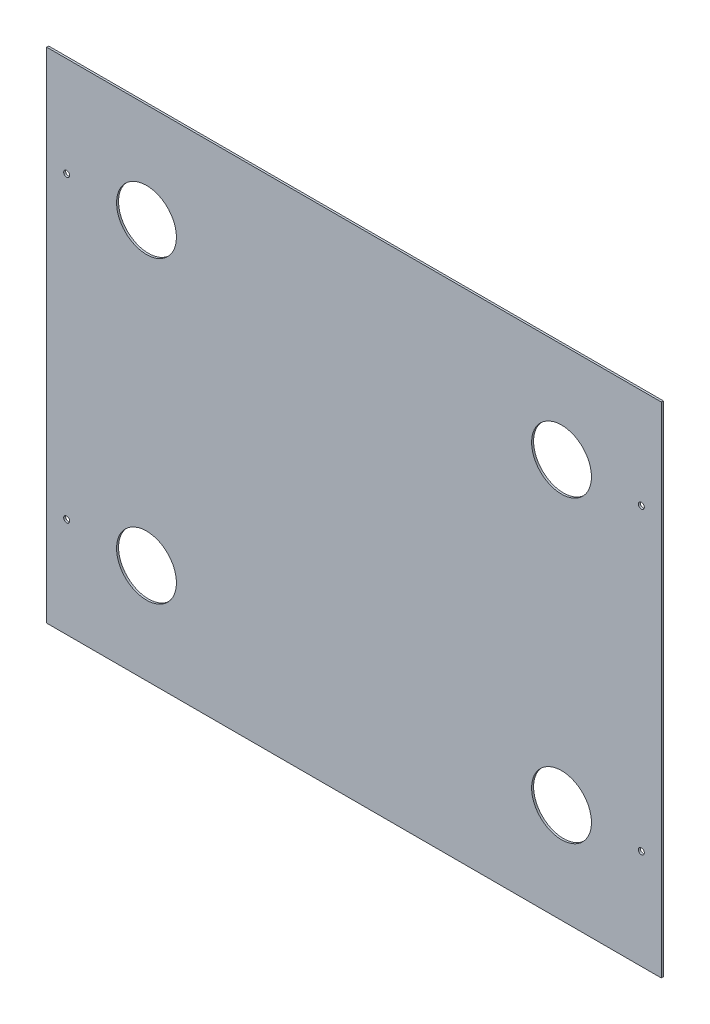
ISO-10303-21;
HEADER;
FILE_DESCRIPTION(('STEP AP214'),'2;1');
FILE_NAME('part.step','',(''),(''),'','','');
FILE_SCHEMA(('AUTOMOTIVE_DESIGN { 1 0 10303 214 1 1 1 1 }'));
ENDSEC;
DATA;
#1=APPLICATION_CONTEXT('core data for automotive mechanical design processes');
#2=APPLICATION_PROTOCOL_DEFINITION('international standard','automotive_design',2000,#1);
#3=PRODUCT_CONTEXT('',#1,'mechanical');
#4=PRODUCT('Part','Part','',(#3));
#5=PRODUCT_RELATED_PRODUCT_CATEGORY('part','',(#4));
#6=PRODUCT_DEFINITION_FORMATION('','',#4);
#7=PRODUCT_DEFINITION_CONTEXT('part definition',#1,'design');
#8=PRODUCT_DEFINITION('design','',#6,#7);
#9=PRODUCT_DEFINITION_SHAPE('','',#8);
#10=(LENGTH_UNIT() NAMED_UNIT(*) SI_UNIT(.MILLI.,.METRE.));
#11=(NAMED_UNIT(*) PLANE_ANGLE_UNIT() SI_UNIT($,.RADIAN.));
#12=(NAMED_UNIT(*) SI_UNIT($,.STERADIAN.) SOLID_ANGLE_UNIT());
#13=UNCERTAINTY_MEASURE_WITH_UNIT(LENGTH_MEASURE(1.E-05),#10,'distance_accuracy_value','');
#14=(GEOMETRIC_REPRESENTATION_CONTEXT(3) GLOBAL_UNCERTAINTY_ASSIGNED_CONTEXT((#13)) GLOBAL_UNIT_ASSIGNED_CONTEXT((#10,
#11,#12)) REPRESENTATION_CONTEXT('',''));
#15=CARTESIAN_POINT('',(0.,0.,0.));
#16=DIRECTION('',(0.,0.,1.));
#17=DIRECTION('',(1.,0.,0.));
#18=AXIS2_PLACEMENT_3D('',#15,#16,#17);
#19=CARTESIAN_POINT('',(0.,250.,1.));
#20=DIRECTION('',(1.,0.,0.));
#21=DIRECTION('',(0.,1.,0.));
#22=AXIS2_PLACEMENT_3D('',#19,#20,#21);
#23=PLANE('',#22);
#24=DIRECTION('',(0.,-1.,0.));
#25=VECTOR('',#24,1.);
#26=CARTESIAN_POINT('',(0.,250.,0.));
#27=LINE('',#26,#25);
#28=CARTESIAN_POINT('',(0.,250.,0.));
#29=VERTEX_POINT('',#28);
#30=CARTESIAN_POINT('',(0.,0.,0.));
#31=VERTEX_POINT('',#30);
#32=EDGE_CURVE('E95',#29,#31,#27,.T.);
#33=ORIENTED_EDGE('',*,*,#32,.T.);
#34=DIRECTION('',(0.,0.,-1.));
#35=VECTOR('',#34,1.);
#36=CARTESIAN_POINT('',(0.,0.,1.));
#37=LINE('',#36,#35);
#38=CARTESIAN_POINT('',(0.,0.,1.));
#39=VERTEX_POINT('',#38);
#40=EDGE_CURVE('E11',#39,#31,#37,.T.);
#41=ORIENTED_EDGE('',*,*,#40,.F.);
#42=DIRECTION('',(0.,-1.,0.));
#43=VECTOR('',#42,1.);
#44=CARTESIAN_POINT('',(0.,250.,1.));
#45=LINE('',#44,#43);
#46=CARTESIAN_POINT('',(0.,250.,1.));
#47=VERTEX_POINT('',#46);
#48=EDGE_CURVE('E83',#47,#39,#45,.T.);
#49=ORIENTED_EDGE('',*,*,#48,.F.);
#50=DIRECTION('',(0.,0.,-1.));
#51=VECTOR('',#50,1.);
#52=CARTESIAN_POINT('',(0.,250.,1.));
#53=LINE('',#52,#51);
#54=EDGE_CURVE('E91',#47,#29,#53,.T.);
#55=ORIENTED_EDGE('',*,*,#54,.T.);
#56=EDGE_LOOP('',(#33,#41,#49,#55));
#57=FACE_BOUND('',#56,.T.);
#58=ADVANCED_FACE('F32',(#57),#23,.F.);
#59=CARTESIAN_POINT('',(0.,0.,1.));
#60=DIRECTION('',(0.,1.,0.));
#61=DIRECTION('',(0.,0.,1.));
#62=AXIS2_PLACEMENT_3D('',#59,#60,#61);
#63=PLANE('',#62);
#64=DIRECTION('',(1.,0.,0.));
#65=VECTOR('',#64,1.);
#66=CARTESIAN_POINT('',(0.,0.,0.));
#67=LINE('',#66,#65);
#68=CARTESIAN_POINT('',(308.,0.,0.));
#69=VERTEX_POINT('',#68);
#70=EDGE_CURVE('E87',#31,#69,#67,.T.);
#71=ORIENTED_EDGE('',*,*,#70,.T.);
#72=DIRECTION('',(0.,0.,-1.));
#73=VECTOR('',#72,1.);
#74=CARTESIAN_POINT('',(308.,0.,1.));
#75=LINE('',#74,#73);
#76=CARTESIAN_POINT('',(308.,0.,1.));
#77=VERTEX_POINT('',#76);
#78=EDGE_CURVE('E40',#77,#69,#75,.T.);
#79=ORIENTED_EDGE('',*,*,#78,.F.);
#80=DIRECTION('',(1.,0.,0.));
#81=VECTOR('',#80,1.);
#82=CARTESIAN_POINT('',(0.,0.,1.));
#83=LINE('',#82,#81);
#84=EDGE_CURVE('E78',#39,#77,#83,.T.);
#85=ORIENTED_EDGE('',*,*,#84,.F.);
#86=ORIENTED_EDGE('',*,*,#40,.T.);
#87=EDGE_LOOP('',(#71,#79,#85,#86));
#88=FACE_BOUND('',#87,.T.);
#89=ADVANCED_FACE('F86',(#88),#63,.F.);
#90=CARTESIAN_POINT('',(308.,250.,1.));
#91=DIRECTION('',(-1.,0.,0.));
#92=DIRECTION('',(0.,-1.,0.));
#93=AXIS2_PLACEMENT_3D('',#90,#91,#92);
#94=PLANE('',#93);
#95=DIRECTION('',(0.,1.,0.));
#96=VECTOR('',#95,1.);
#97=CARTESIAN_POINT('',(308.,250.,0.));
#98=LINE('',#97,#96);
#99=CARTESIAN_POINT('',(308.,250.,0.));
#100=VERTEX_POINT('',#99);
#101=EDGE_CURVE('E65',#69,#100,#98,.T.);
#102=ORIENTED_EDGE('',*,*,#101,.T.);
#103=DIRECTION('',(0.,0.,-1.));
#104=VECTOR('',#103,1.);
#105=CARTESIAN_POINT('',(308.,250.,1.));
#106=LINE('',#105,#104);
#107=CARTESIAN_POINT('',(308.,250.,1.));
#108=VERTEX_POINT('',#107);
#109=EDGE_CURVE('E88',#108,#100,#106,.T.);
#110=ORIENTED_EDGE('',*,*,#109,.F.);
#111=DIRECTION('',(0.,1.,0.));
#112=VECTOR('',#111,1.);
#113=CARTESIAN_POINT('',(308.,250.,1.));
#114=LINE('',#113,#112);
#115=EDGE_CURVE('E81',#77,#108,#114,.T.);
#116=ORIENTED_EDGE('',*,*,#115,.F.);
#117=ORIENTED_EDGE('',*,*,#78,.T.);
#118=EDGE_LOOP('',(#102,#110,#116,#117));
#119=FACE_BOUND('',#118,.T.);
#120=ADVANCED_FACE('F89',(#119),#94,.F.);
#121=CARTESIAN_POINT('',(0.,250.,1.));
#122=DIRECTION('',(0.,-1.,0.));
#123=DIRECTION('',(0.,0.,-1.));
#124=AXIS2_PLACEMENT_3D('',#121,#122,#123);
#125=PLANE('',#124);
#126=DIRECTION('',(-1.,0.,0.));
#127=VECTOR('',#126,1.);
#128=CARTESIAN_POINT('',(0.,250.,0.));
#129=LINE('',#128,#127);
#130=EDGE_CURVE('E71',#100,#29,#129,.T.);
#131=ORIENTED_EDGE('',*,*,#130,.T.);
#132=ORIENTED_EDGE('',*,*,#54,.F.);
#133=DIRECTION('',(-1.,0.,0.));
#134=VECTOR('',#133,1.);
#135=CARTESIAN_POINT('',(0.,250.,1.));
#136=LINE('',#135,#134);
#137=EDGE_CURVE('E48',#108,#47,#136,.T.);
#138=ORIENTED_EDGE('',*,*,#137,.F.);
#139=ORIENTED_EDGE('',*,*,#109,.T.);
#140=EDGE_LOOP('',(#131,#132,#138,#139));
#141=FACE_BOUND('',#140,.T.);
#142=ADVANCED_FACE('F103',(#141),#125,.F.);
#143=CARTESIAN_POINT('',(0.,0.,1.));
#144=DIRECTION('',(0.,0.,1.));
#145=DIRECTION('',(1.,0.,0.));
#146=AXIS2_PLACEMENT_3D('',#143,#144,#145);
#147=PLANE('',#146);
#148=CARTESIAN_POINT('',(258.,50.,1.));
#149=DIRECTION('',(0.,0.,1.));
#150=DIRECTION('',(1.,0.,0.));
#151=AXIS2_PLACEMENT_3D('',#148,#149,#150);
#152=CIRCLE('',#151,15.);
#153=CARTESIAN_POINT('',(273.,50.,1.));
#154=VERTEX_POINT('',#153);
#155=EDGE_CURVE('E151',#154,#154,#152,.T.);
#156=ORIENTED_EDGE('',*,*,#155,.F.);
#157=EDGE_LOOP('',(#156));
#158=FACE_BOUND('',#157,.T.);
#159=CARTESIAN_POINT('',(50.,50.,1.));
#160=DIRECTION('',(0.,0.,1.));
#161=DIRECTION('',(1.,0.,0.));
#162=AXIS2_PLACEMENT_3D('',#159,#160,#161);
#163=CIRCLE('',#162,15.);
#164=CARTESIAN_POINT('',(65.,50.,1.));
#165=VERTEX_POINT('',#164);
#166=EDGE_CURVE('E145',#165,#165,#163,.T.);
#167=ORIENTED_EDGE('',*,*,#166,.F.);
#168=EDGE_LOOP('',(#167));
#169=FACE_BOUND('',#168,.T.);
#170=CARTESIAN_POINT('',(258.,200.,1.));
#171=DIRECTION('',(0.,0.,1.));
#172=DIRECTION('',(1.,0.,0.));
#173=AXIS2_PLACEMENT_3D('',#170,#171,#172);
#174=CIRCLE('',#173,15.);
#175=CARTESIAN_POINT('',(273.,200.,1.));
#176=VERTEX_POINT('',#175);
#177=EDGE_CURVE('E139',#176,#176,#174,.T.);
#178=ORIENTED_EDGE('',*,*,#177,.F.);
#179=EDGE_LOOP('',(#178));
#180=FACE_BOUND('',#179,.T.);
#181=CARTESIAN_POINT('',(50.,200.,1.));
#182=DIRECTION('',(0.,0.,1.));
#183=DIRECTION('',(1.,0.,0.));
#184=AXIS2_PLACEMENT_3D('',#181,#182,#183);
#185=CIRCLE('',#184,15.);
#186=CARTESIAN_POINT('',(65.,200.,1.));
#187=VERTEX_POINT('',#186);
#188=EDGE_CURVE('E133',#187,#187,#185,.T.);
#189=ORIENTED_EDGE('',*,*,#188,.F.);
#190=EDGE_LOOP('',(#189));
#191=FACE_BOUND('',#190,.T.);
#192=CARTESIAN_POINT('',(298.,50.,1.));
#193=DIRECTION('',(0.,0.,1.));
#194=DIRECTION('',(1.,0.,0.));
#195=AXIS2_PLACEMENT_3D('',#192,#193,#194);
#196=CIRCLE('',#195,1.50000000000002);
#197=CARTESIAN_POINT('',(299.5,50.,1.));
#198=VERTEX_POINT('',#197);
#199=EDGE_CURVE('E127',#198,#198,#196,.T.);
#200=ORIENTED_EDGE('',*,*,#199,.F.);
#201=EDGE_LOOP('',(#200));
#202=FACE_BOUND('',#201,.T.);
#203=CARTESIAN_POINT('',(9.99999999999999,50.,1.));
#204=DIRECTION('',(0.,0.,1.));
#205=DIRECTION('',(1.,0.,0.));
#206=AXIS2_PLACEMENT_3D('',#203,#204,#205);
#207=CIRCLE('',#206,1.5);
#208=CARTESIAN_POINT('',(11.5,50.,1.));
#209=VERTEX_POINT('',#208);
#210=EDGE_CURVE('E121',#209,#209,#207,.T.);
#211=ORIENTED_EDGE('',*,*,#210,.F.);
#212=EDGE_LOOP('',(#211));
#213=FACE_BOUND('',#212,.T.);
#214=CARTESIAN_POINT('',(298.,200.,1.));
#215=DIRECTION('',(0.,0.,1.));
#216=DIRECTION('',(1.,0.,0.));
#217=AXIS2_PLACEMENT_3D('',#214,#215,#216);
#218=CIRCLE('',#217,1.50000000000002);
#219=CARTESIAN_POINT('',(299.5,200.,1.));
#220=VERTEX_POINT('',#219);
#221=EDGE_CURVE('E115',#220,#220,#218,.T.);
#222=ORIENTED_EDGE('',*,*,#221,.F.);
#223=EDGE_LOOP('',(#222));
#224=FACE_BOUND('',#223,.T.);
#225=CARTESIAN_POINT('',(9.99999999999997,200.,1.));
#226=DIRECTION('',(0.,0.,1.));
#227=DIRECTION('',(1.,0.,0.));
#228=AXIS2_PLACEMENT_3D('',#225,#226,#227);
#229=CIRCLE('',#228,1.5);
#230=CARTESIAN_POINT('',(11.5,200.,1.));
#231=VERTEX_POINT('',#230);
#232=EDGE_CURVE('E109',#231,#231,#229,.T.);
#233=ORIENTED_EDGE('',*,*,#232,.F.);
#234=EDGE_LOOP('',(#233));
#235=FACE_BOUND('',#234,.T.);
#236=ORIENTED_EDGE('',*,*,#48,.T.);
#237=ORIENTED_EDGE('',*,*,#84,.T.);
#238=ORIENTED_EDGE('',*,*,#115,.T.);
#239=ORIENTED_EDGE('',*,*,#137,.T.);
#240=EDGE_LOOP('',(#236,#237,#238,#239));
#241=FACE_BOUND('',#240,.T.);
#242=ADVANCED_FACE('F79',(#158,#169,#180,#191,#202,#213,#224,#235,#241),#147,.T.);
#243=CARTESIAN_POINT('',(0.,0.,0.));
#244=DIRECTION('',(0.,0.,1.));
#245=DIRECTION('',(1.,0.,0.));
#246=AXIS2_PLACEMENT_3D('',#243,#244,#245);
#247=PLANE('',#246);
#248=CARTESIAN_POINT('',(258.,50.,0.));
#249=DIRECTION('',(0.,0.,1.));
#250=DIRECTION('',(1.,0.,0.));
#251=AXIS2_PLACEMENT_3D('',#248,#249,#250);
#252=CIRCLE('',#251,15.);
#253=CARTESIAN_POINT('',(273.,50.,0.));
#254=VERTEX_POINT('',#253);
#255=EDGE_CURVE('E148',#254,#254,#252,.T.);
#256=ORIENTED_EDGE('',*,*,#255,.T.);
#257=EDGE_LOOP('',(#256));
#258=FACE_BOUND('',#257,.T.);
#259=CARTESIAN_POINT('',(50.,50.,0.));
#260=DIRECTION('',(0.,0.,1.));
#261=DIRECTION('',(1.,0.,0.));
#262=AXIS2_PLACEMENT_3D('',#259,#260,#261);
#263=CIRCLE('',#262,15.);
#264=CARTESIAN_POINT('',(65.,50.,0.));
#265=VERTEX_POINT('',#264);
#266=EDGE_CURVE('E142',#265,#265,#263,.T.);
#267=ORIENTED_EDGE('',*,*,#266,.T.);
#268=EDGE_LOOP('',(#267));
#269=FACE_BOUND('',#268,.T.);
#270=CARTESIAN_POINT('',(258.,200.,0.));
#271=DIRECTION('',(0.,0.,1.));
#272=DIRECTION('',(1.,0.,0.));
#273=AXIS2_PLACEMENT_3D('',#270,#271,#272);
#274=CIRCLE('',#273,15.);
#275=CARTESIAN_POINT('',(273.,200.,0.));
#276=VERTEX_POINT('',#275);
#277=EDGE_CURVE('E136',#276,#276,#274,.T.);
#278=ORIENTED_EDGE('',*,*,#277,.T.);
#279=EDGE_LOOP('',(#278));
#280=FACE_BOUND('',#279,.T.);
#281=CARTESIAN_POINT('',(50.,200.,0.));
#282=DIRECTION('',(0.,0.,1.));
#283=DIRECTION('',(1.,0.,0.));
#284=AXIS2_PLACEMENT_3D('',#281,#282,#283);
#285=CIRCLE('',#284,15.);
#286=CARTESIAN_POINT('',(65.,200.,0.));
#287=VERTEX_POINT('',#286);
#288=EDGE_CURVE('E130',#287,#287,#285,.T.);
#289=ORIENTED_EDGE('',*,*,#288,.T.);
#290=EDGE_LOOP('',(#289));
#291=FACE_BOUND('',#290,.T.);
#292=CARTESIAN_POINT('',(298.,50.,0.));
#293=DIRECTION('',(0.,0.,1.));
#294=DIRECTION('',(1.,0.,0.));
#295=AXIS2_PLACEMENT_3D('',#292,#293,#294);
#296=CIRCLE('',#295,1.50000000000002);
#297=CARTESIAN_POINT('',(299.5,50.,0.));
#298=VERTEX_POINT('',#297);
#299=EDGE_CURVE('E124',#298,#298,#296,.T.);
#300=ORIENTED_EDGE('',*,*,#299,.T.);
#301=EDGE_LOOP('',(#300));
#302=FACE_BOUND('',#301,.T.);
#303=CARTESIAN_POINT('',(9.99999999999999,50.,0.));
#304=DIRECTION('',(0.,0.,1.));
#305=DIRECTION('',(1.,0.,0.));
#306=AXIS2_PLACEMENT_3D('',#303,#304,#305);
#307=CIRCLE('',#306,1.5);
#308=CARTESIAN_POINT('',(11.5,50.,0.));
#309=VERTEX_POINT('',#308);
#310=EDGE_CURVE('E118',#309,#309,#307,.T.);
#311=ORIENTED_EDGE('',*,*,#310,.T.);
#312=EDGE_LOOP('',(#311));
#313=FACE_BOUND('',#312,.T.);
#314=CARTESIAN_POINT('',(298.,200.,0.));
#315=DIRECTION('',(0.,0.,1.));
#316=DIRECTION('',(1.,0.,0.));
#317=AXIS2_PLACEMENT_3D('',#314,#315,#316);
#318=CIRCLE('',#317,1.50000000000002);
#319=CARTESIAN_POINT('',(299.5,200.,0.));
#320=VERTEX_POINT('',#319);
#321=EDGE_CURVE('E112',#320,#320,#318,.T.);
#322=ORIENTED_EDGE('',*,*,#321,.T.);
#323=EDGE_LOOP('',(#322));
#324=FACE_BOUND('',#323,.T.);
#325=CARTESIAN_POINT('',(9.99999999999997,200.,0.));
#326=DIRECTION('',(0.,0.,1.));
#327=DIRECTION('',(1.,0.,0.));
#328=AXIS2_PLACEMENT_3D('',#325,#326,#327);
#329=CIRCLE('',#328,1.5);
#330=CARTESIAN_POINT('',(11.5,200.,0.));
#331=VERTEX_POINT('',#330);
#332=EDGE_CURVE('E98',#331,#331,#329,.T.);
#333=ORIENTED_EDGE('',*,*,#332,.T.);
#334=EDGE_LOOP('',(#333));
#335=FACE_BOUND('',#334,.T.);
#336=ORIENTED_EDGE('',*,*,#32,.F.);
#337=ORIENTED_EDGE('',*,*,#130,.F.);
#338=ORIENTED_EDGE('',*,*,#101,.F.);
#339=ORIENTED_EDGE('',*,*,#70,.F.);
#340=EDGE_LOOP('',(#336,#337,#338,#339));
#341=FACE_BOUND('',#340,.T.);
#342=ADVANCED_FACE('F106',(#258,#269,#280,#291,#302,#313,#324,#335,#341),#247,.F.);
#343=CARTESIAN_POINT('',(9.99999999999997,200.,0.));
#344=DIRECTION('',(0.,0.,1.));
#345=DIRECTION('',(1.,0.,0.));
#346=AXIS2_PLACEMENT_3D('',#343,#344,#345);
#347=CYLINDRICAL_SURFACE('',#346,1.5);
#348=ORIENTED_EDGE('',*,*,#332,.F.);
#349=EDGE_LOOP('',(#348));
#350=FACE_BOUND('',#349,.T.);
#351=ORIENTED_EDGE('',*,*,#232,.T.);
#352=EDGE_LOOP('',(#351));
#353=FACE_BOUND('',#352,.T.);
#354=ADVANCED_FACE('F183',(#350,#353),#347,.F.);
#355=CARTESIAN_POINT('',(298.,200.,0.));
#356=DIRECTION('',(0.,0.,1.));
#357=DIRECTION('',(1.,0.,0.));
#358=AXIS2_PLACEMENT_3D('',#355,#356,#357);
#359=CYLINDRICAL_SURFACE('',#358,1.50000000000002);
#360=ORIENTED_EDGE('',*,*,#321,.F.);
#361=EDGE_LOOP('',(#360));
#362=FACE_BOUND('',#361,.T.);
#363=ORIENTED_EDGE('',*,*,#221,.T.);
#364=EDGE_LOOP('',(#363));
#365=FACE_BOUND('',#364,.T.);
#366=ADVANCED_FACE('F185',(#362,#365),#359,.F.);
#367=CARTESIAN_POINT('',(9.99999999999999,50.,0.));
#368=DIRECTION('',(0.,0.,1.));
#369=DIRECTION('',(1.,0.,0.));
#370=AXIS2_PLACEMENT_3D('',#367,#368,#369);
#371=CYLINDRICAL_SURFACE('',#370,1.5);
#372=ORIENTED_EDGE('',*,*,#310,.F.);
#373=EDGE_LOOP('',(#372));
#374=FACE_BOUND('',#373,.T.);
#375=ORIENTED_EDGE('',*,*,#210,.T.);
#376=EDGE_LOOP('',(#375));
#377=FACE_BOUND('',#376,.T.);
#378=ADVANCED_FACE('F192',(#374,#377),#371,.F.);
#379=CARTESIAN_POINT('',(298.,50.,0.));
#380=DIRECTION('',(0.,0.,1.));
#381=DIRECTION('',(1.,0.,0.));
#382=AXIS2_PLACEMENT_3D('',#379,#380,#381);
#383=CYLINDRICAL_SURFACE('',#382,1.50000000000002);
#384=ORIENTED_EDGE('',*,*,#299,.F.);
#385=EDGE_LOOP('',(#384));
#386=FACE_BOUND('',#385,.T.);
#387=ORIENTED_EDGE('',*,*,#199,.T.);
#388=EDGE_LOOP('',(#387));
#389=FACE_BOUND('',#388,.T.);
#390=ADVANCED_FACE('F232',(#386,#389),#383,.F.);
#391=CARTESIAN_POINT('',(50.,200.,0.));
#392=DIRECTION('',(0.,0.,1.));
#393=DIRECTION('',(1.,0.,0.));
#394=AXIS2_PLACEMENT_3D('',#391,#392,#393);
#395=CYLINDRICAL_SURFACE('',#394,15.);
#396=ORIENTED_EDGE('',*,*,#288,.F.);
#397=EDGE_LOOP('',(#396));
#398=FACE_BOUND('',#397,.T.);
#399=ORIENTED_EDGE('',*,*,#188,.T.);
#400=EDGE_LOOP('',(#399));
#401=FACE_BOUND('',#400,.T.);
#402=ADVANCED_FACE('F226',(#398,#401),#395,.F.);
#403=CARTESIAN_POINT('',(258.,200.,0.));
#404=DIRECTION('',(0.,0.,1.));
#405=DIRECTION('',(1.,0.,0.));
#406=AXIS2_PLACEMENT_3D('',#403,#404,#405);
#407=CYLINDRICAL_SURFACE('',#406,15.);
#408=ORIENTED_EDGE('',*,*,#277,.F.);
#409=EDGE_LOOP('',(#408));
#410=FACE_BOUND('',#409,.T.);
#411=ORIENTED_EDGE('',*,*,#177,.T.);
#412=EDGE_LOOP('',(#411));
#413=FACE_BOUND('',#412,.T.);
#414=ADVANCED_FACE('F231',(#410,#413),#407,.F.);
#415=CARTESIAN_POINT('',(50.,50.,0.));
#416=DIRECTION('',(0.,0.,1.));
#417=DIRECTION('',(1.,0.,0.));
#418=AXIS2_PLACEMENT_3D('',#415,#416,#417);
#419=CYLINDRICAL_SURFACE('',#418,15.);
#420=ORIENTED_EDGE('',*,*,#266,.F.);
#421=EDGE_LOOP('',(#420));
#422=FACE_BOUND('',#421,.T.);
#423=ORIENTED_EDGE('',*,*,#166,.T.);
#424=EDGE_LOOP('',(#423));
#425=FACE_BOUND('',#424,.T.);
#426=ADVANCED_FACE('F162',(#422,#425),#419,.F.);
#427=CARTESIAN_POINT('',(258.,50.,0.));
#428=DIRECTION('',(0.,0.,1.));
#429=DIRECTION('',(1.,0.,0.));
#430=AXIS2_PLACEMENT_3D('',#427,#428,#429);
#431=CYLINDRICAL_SURFACE('',#430,15.);
#432=ORIENTED_EDGE('',*,*,#255,.F.);
#433=EDGE_LOOP('',(#432));
#434=FACE_BOUND('',#433,.T.);
#435=ORIENTED_EDGE('',*,*,#155,.T.);
#436=EDGE_LOOP('',(#435));
#437=FACE_BOUND('',#436,.T.);
#438=ADVANCED_FACE('F159',(#434,#437),#431,.F.);
#439=CLOSED_SHELL('',(#58,#89,#120,#142,#242,#342,#354,#366,#378,#390,#402,#414,#426,#438));
#440=MANIFOLD_SOLID_BREP('B2',#439);
#441=ADVANCED_BREP_SHAPE_REPRESENTATION('',(#18,#440),#14);
#442=SHAPE_DEFINITION_REPRESENTATION(#9,#441);
ENDSEC;
END-ISO-10303-21;
